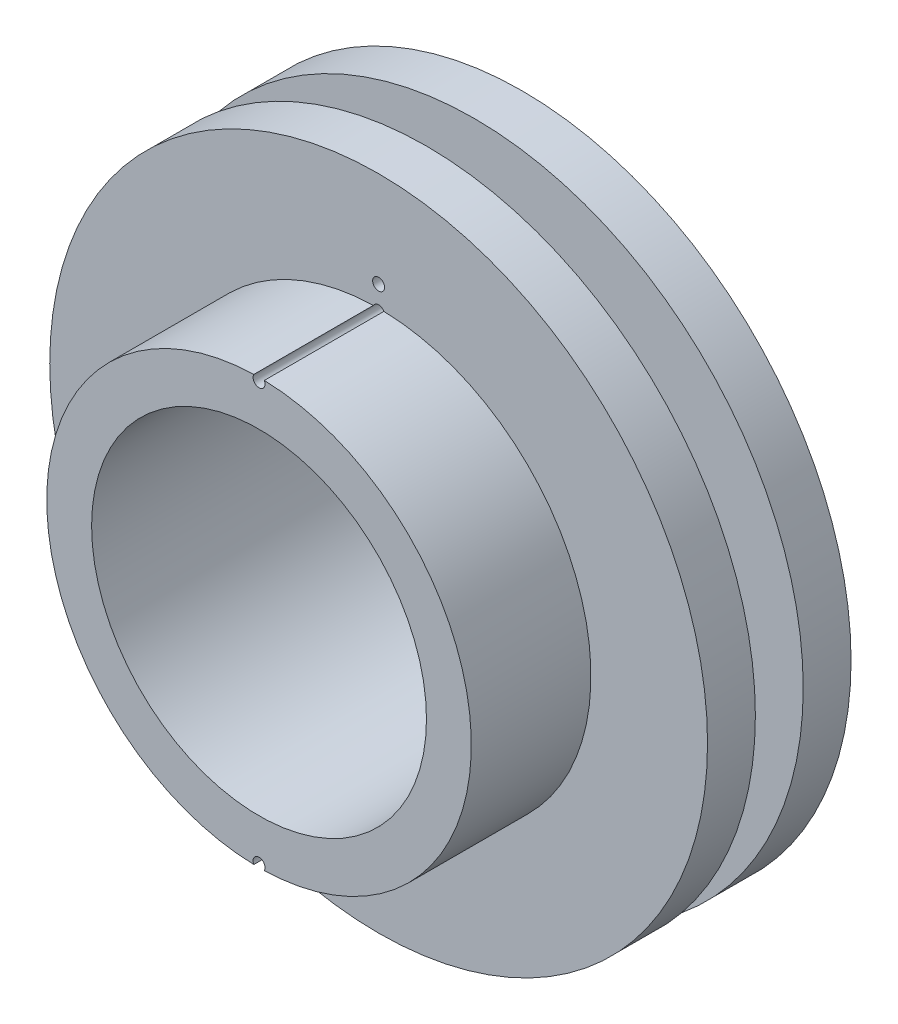
ISO-10303-21;
HEADER;
FILE_DESCRIPTION(('STEP AP214'),'2;1');
FILE_NAME('part.step','',(''),(''),'','','');
FILE_SCHEMA(('AUTOMOTIVE_DESIGN { 1 0 10303 214 1 1 1 1 }'));
ENDSEC;
DATA;
#1=APPLICATION_CONTEXT('core data for automotive mechanical design processes');
#2=APPLICATION_PROTOCOL_DEFINITION('international standard','automotive_design',2000,#1);
#3=PRODUCT_CONTEXT('',#1,'mechanical');
#4=PRODUCT('Part','Part','',(#3));
#5=PRODUCT_RELATED_PRODUCT_CATEGORY('part','',(#4));
#6=PRODUCT_DEFINITION_FORMATION('','',#4);
#7=PRODUCT_DEFINITION_CONTEXT('part definition',#1,'design');
#8=PRODUCT_DEFINITION('design','',#6,#7);
#9=PRODUCT_DEFINITION_SHAPE('','',#8);
#10=(LENGTH_UNIT() NAMED_UNIT(*) SI_UNIT(.MILLI.,.METRE.));
#11=(NAMED_UNIT(*) PLANE_ANGLE_UNIT() SI_UNIT($,.RADIAN.));
#12=(NAMED_UNIT(*) SI_UNIT($,.STERADIAN.) SOLID_ANGLE_UNIT());
#13=UNCERTAINTY_MEASURE_WITH_UNIT(LENGTH_MEASURE(1.E-05),#10,'distance_accuracy_value','');
#14=(GEOMETRIC_REPRESENTATION_CONTEXT(3) GLOBAL_UNCERTAINTY_ASSIGNED_CONTEXT((#13)) GLOBAL_UNIT_ASSIGNED_CONTEXT((#10,
#11,#12)) REPRESENTATION_CONTEXT('',''));
#15=CARTESIAN_POINT('',(0.,0.,0.));
#16=DIRECTION('',(0.,0.,1.));
#17=DIRECTION('',(1.,0.,0.));
#18=AXIS2_PLACEMENT_3D('',#15,#16,#17);
#19=CARTESIAN_POINT('',(0.,0.,6.));
#20=DIRECTION('',(0.,0.,1.));
#21=DIRECTION('',(1.,0.,0.));
#22=AXIS2_PLACEMENT_3D('',#19,#20,#21);
#23=PLANE('',#22);
#24=CARTESIAN_POINT('',(0.,9.75,6.));
#25=DIRECTION('',(0.,0.,1.));
#26=DIRECTION('',(1.,0.,0.));
#27=AXIS2_PLACEMENT_3D('',#24,#25,#26);
#28=CIRCLE('',#27,0.25);
#29=CARTESIAN_POINT('',(0.25,9.75,6.));
#30=VERTEX_POINT('',#29);
#31=EDGE_CURVE('E150',#30,#30,#28,.F.);
#32=ORIENTED_EDGE('',*,*,#31,.T.);
#33=EDGE_LOOP('',(#32));
#34=FACE_BOUND('',#33,.T.);
#35=CARTESIAN_POINT('',(0.,0.,6.));
#36=DIRECTION('',(0.,0.,1.));
#37=DIRECTION('',(1.,0.,0.));
#38=AXIS2_PLACEMENT_3D('',#35,#36,#37);
#39=CIRCLE('',#38,13.75);
#40=CARTESIAN_POINT('',(13.75,0.,6.));
#41=VERTEX_POINT('',#40);
#42=EDGE_CURVE('E107',#41,#41,#39,.T.);
#43=ORIENTED_EDGE('',*,*,#42,.T.);
#44=EDGE_LOOP('',(#43));
#45=FACE_BOUND('',#44,.T.);
#46=CARTESIAN_POINT('',(0.,-9.75,6.));
#47=DIRECTION('',(0.,0.,1.));
#48=DIRECTION('',(1.,0.,0.));
#49=AXIS2_PLACEMENT_3D('',#46,#47,#48);
#50=CIRCLE('',#49,0.25);
#51=CARTESIAN_POINT('',(0.25,-9.75,6.));
#52=VERTEX_POINT('',#51);
#53=EDGE_CURVE('E140',#52,#52,#50,.F.);
#54=ORIENTED_EDGE('',*,*,#53,.T.);
#55=EDGE_LOOP('',(#54));
#56=FACE_BOUND('',#55,.T.);
#57=CARTESIAN_POINT('',(0.,0.,6.));
#58=DIRECTION('',(0.,0.,1.));
#59=DIRECTION('',(1.,0.,0.));
#60=AXIS2_PLACEMENT_3D('',#57,#58,#59);
#61=CIRCLE('',#60,8.875);
#62=CARTESIAN_POINT('',(0.218030887977479,-8.87232142857143,6.));
#63=VERTEX_POINT('',#62);
#64=CARTESIAN_POINT('',(0.218030887977508,8.87232142857143,6.));
#65=VERTEX_POINT('',#64);
#66=EDGE_CURVE('E105',#63,#65,#61,.T.);
#67=ORIENTED_EDGE('',*,*,#66,.F.);
#68=CARTESIAN_POINT('',(0.,-8.75,6.));
#69=DIRECTION('',(0.,0.,1.));
#70=DIRECTION('',(1.,0.,0.));
#71=AXIS2_PLACEMENT_3D('',#68,#69,#70);
#72=CIRCLE('',#71,0.25);
#73=CARTESIAN_POINT('',(-0.218030887977508,-8.87232142857143,6.));
#74=VERTEX_POINT('',#73);
#75=EDGE_CURVE('E47',#63,#74,#72,.F.);
#76=ORIENTED_EDGE('',*,*,#75,.T.);
#77=CARTESIAN_POINT('',(-0.21803088797748,8.87232142857143,6.));
#78=VERTEX_POINT('',#77);
#79=EDGE_CURVE('E90',#78,#74,#61,.T.);
#80=ORIENTED_EDGE('',*,*,#79,.F.);
#81=CARTESIAN_POINT('',(0.,8.75,6.));
#82=DIRECTION('',(0.,0.,1.));
#83=DIRECTION('',(1.,0.,0.));
#84=AXIS2_PLACEMENT_3D('',#81,#82,#83);
#85=CIRCLE('',#84,0.25);
#86=EDGE_CURVE('E133',#78,#65,#85,.F.);
#87=ORIENTED_EDGE('',*,*,#86,.T.);
#88=EDGE_LOOP('',(#67,#76,#80,#87));
#89=FACE_BOUND('',#88,.T.);
#90=ADVANCED_FACE('F33',(#34,#45,#56,#89),#23,.T.);
#91=CARTESIAN_POINT('',(0.,0.,4.));
#92=DIRECTION('',(0.,0.,1.));
#93=DIRECTION('',(1.,0.,0.));
#94=AXIS2_PLACEMENT_3D('',#91,#92,#93);
#95=PLANE('',#94);
#96=CARTESIAN_POINT('',(0.,9.75,4.));
#97=DIRECTION('',(0.,0.,1.));
#98=DIRECTION('',(1.,0.,0.));
#99=AXIS2_PLACEMENT_3D('',#96,#97,#98);
#100=CIRCLE('',#99,0.25);
#101=CARTESIAN_POINT('',(0.25,9.75,4.));
#102=VERTEX_POINT('',#101);
#103=EDGE_CURVE('E148',#102,#102,#100,.T.);
#104=ORIENTED_EDGE('',*,*,#103,.T.);
#105=EDGE_LOOP('',(#104));
#106=FACE_BOUND('',#105,.T.);
#107=CARTESIAN_POINT('',(0.,0.,4.));
#108=DIRECTION('',(0.,0.,1.));
#109=DIRECTION('',(1.,0.,0.));
#110=AXIS2_PLACEMENT_3D('',#107,#108,#109);
#111=CIRCLE('',#110,13.75);
#112=CARTESIAN_POINT('',(13.75,0.,4.));
#113=VERTEX_POINT('',#112);
#114=EDGE_CURVE('E99',#113,#113,#111,.T.);
#115=ORIENTED_EDGE('',*,*,#114,.F.);
#116=EDGE_LOOP('',(#115));
#117=FACE_BOUND('',#116,.T.);
#118=CARTESIAN_POINT('',(0.,-9.75,4.));
#119=DIRECTION('',(0.,0.,1.));
#120=DIRECTION('',(1.,0.,0.));
#121=AXIS2_PLACEMENT_3D('',#118,#119,#120);
#122=CIRCLE('',#121,0.25);
#123=CARTESIAN_POINT('',(0.25,-9.75,4.));
#124=VERTEX_POINT('',#123);
#125=EDGE_CURVE('E137',#124,#124,#122,.T.);
#126=ORIENTED_EDGE('',*,*,#125,.T.);
#127=EDGE_LOOP('',(#126));
#128=FACE_BOUND('',#127,.T.);
#129=CARTESIAN_POINT('',(0.,0.,4.));
#130=DIRECTION('',(0.,0.,1.));
#131=DIRECTION('',(1.,0.,0.));
#132=AXIS2_PLACEMENT_3D('',#129,#130,#131);
#133=CIRCLE('',#132,8.5);
#134=CARTESIAN_POINT('',(0.,8.5,4.));
#135=VERTEX_POINT('',#134);
#136=CARTESIAN_POINT('',(0.,-8.5,4.));
#137=VERTEX_POINT('',#136);
#138=EDGE_CURVE('E122',#135,#137,#133,.T.);
#139=ORIENTED_EDGE('',*,*,#138,.T.);
#140=CARTESIAN_POINT('',(0.,-8.75,4.));
#141=DIRECTION('',(0.,0.,1.));
#142=DIRECTION('',(1.,0.,0.));
#143=AXIS2_PLACEMENT_3D('',#140,#141,#142);
#144=CIRCLE('',#143,0.25);
#145=EDGE_CURVE('E53',#137,#137,#144,.T.);
#146=ORIENTED_EDGE('',*,*,#145,.T.);
#147=EDGE_CURVE('E119',#137,#135,#133,.T.);
#148=ORIENTED_EDGE('',*,*,#147,.T.);
#149=CARTESIAN_POINT('',(0.,8.75,4.));
#150=DIRECTION('',(0.,0.,1.));
#151=DIRECTION('',(1.,0.,0.));
#152=AXIS2_PLACEMENT_3D('',#149,#150,#151);
#153=CIRCLE('',#152,0.25);
#154=EDGE_CURVE('E142',#135,#135,#153,.T.);
#155=ORIENTED_EDGE('',*,*,#154,.T.);
#156=EDGE_LOOP('',(#139,#146,#148,#155));
#157=FACE_BOUND('',#156,.T.);
#158=ADVANCED_FACE('F170',(#106,#117,#128,#157),#95,.F.);
#159=CARTESIAN_POINT('',(0.,0.,11.));
#160=DIRECTION('',(0.,0.,1.));
#161=DIRECTION('',(1.,0.,0.));
#162=AXIS2_PLACEMENT_3D('',#159,#160,#161);
#163=PLANE('',#162);
#164=CARTESIAN_POINT('',(0.,0.,11.));
#165=DIRECTION('',(0.,0.,1.));
#166=DIRECTION('',(1.,0.,0.));
#167=AXIS2_PLACEMENT_3D('',#164,#165,#166);
#168=CIRCLE('',#167,7.);
#169=CARTESIAN_POINT('',(7.,0.,11.));
#170=VERTEX_POINT('',#169);
#171=EDGE_CURVE('E103',#170,#170,#168,.T.);
#172=ORIENTED_EDGE('',*,*,#171,.F.);
#173=EDGE_LOOP('',(#172));
#174=FACE_BOUND('',#173,.T.);
#175=CARTESIAN_POINT('',(0.,0.,11.));
#176=DIRECTION('',(0.,0.,1.));
#177=DIRECTION('',(1.,0.,0.));
#178=AXIS2_PLACEMENT_3D('',#175,#176,#177);
#179=CIRCLE('',#178,8.875);
#180=CARTESIAN_POINT('',(-0.218030887977472,8.87232142857143,11.));
#181=VERTEX_POINT('',#180);
#182=CARTESIAN_POINT('',(-0.218030887977472,-8.87232142857143,11.));
#183=VERTEX_POINT('',#182);
#184=EDGE_CURVE('E88',#181,#183,#179,.T.);
#185=ORIENTED_EDGE('',*,*,#184,.T.);
#186=CARTESIAN_POINT('',(0.,-8.75,11.));
#187=DIRECTION('',(0.,0.,1.));
#188=DIRECTION('',(1.,0.,0.));
#189=AXIS2_PLACEMENT_3D('',#186,#187,#188);
#190=CIRCLE('',#189,0.25);
#191=CARTESIAN_POINT('',(0.218030887977472,-8.87232142857143,11.));
#192=VERTEX_POINT('',#191);
#193=EDGE_CURVE('E76',#192,#183,#190,.T.);
#194=ORIENTED_EDGE('',*,*,#193,.F.);
#195=CARTESIAN_POINT('',(0.218030887977472,8.87232142857143,11.));
#196=VERTEX_POINT('',#195);
#197=EDGE_CURVE('E96',#192,#196,#179,.T.);
#198=ORIENTED_EDGE('',*,*,#197,.T.);
#199=CARTESIAN_POINT('',(0.,8.75,11.));
#200=DIRECTION('',(0.,0.,1.));
#201=DIRECTION('',(1.,0.,0.));
#202=AXIS2_PLACEMENT_3D('',#199,#200,#201);
#203=CIRCLE('',#202,0.25);
#204=EDGE_CURVE('E94',#181,#196,#203,.T.);
#205=ORIENTED_EDGE('',*,*,#204,.F.);
#206=EDGE_LOOP('',(#185,#194,#198,#205));
#207=FACE_BOUND('',#206,.T.);
#208=ADVANCED_FACE('F92',(#174,#207),#163,.T.);
#209=CARTESIAN_POINT('',(0.,0.,11.));
#210=DIRECTION('',(0.,0.,-1.));
#211=DIRECTION('',(-1.,0.,0.));
#212=AXIS2_PLACEMENT_3D('',#209,#210,#211);
#213=CYLINDRICAL_SURFACE('',#212,8.875);
#214=DIRECTION('',(0.,0.,-1.));
#215=VECTOR('',#214,1.);
#216=CARTESIAN_POINT('',(-0.218030887977481,-8.87232142857141,7.5));
#217=LINE('',#216,#215);
#218=EDGE_CURVE('E11',#183,#74,#217,.T.);
#219=ORIENTED_EDGE('',*,*,#218,.F.);
#220=ORIENTED_EDGE('',*,*,#184,.F.);
#221=DIRECTION('',(0.,0.,-1.));
#222=VECTOR('',#221,1.);
#223=CARTESIAN_POINT('',(-0.218030887977481,8.87232142857141,7.5));
#224=LINE('',#223,#222);
#225=EDGE_CURVE('E125',#78,#181,#224,.F.);
#226=ORIENTED_EDGE('',*,*,#225,.F.);
#227=ORIENTED_EDGE('',*,*,#79,.T.);
#228=EDGE_LOOP('',(#219,#220,#226,#227));
#229=FACE_BOUND('',#228,.T.);
#230=ADVANCED_FACE('F86',(#229),#213,.T.);
#231=DIRECTION('',(0.,0.,-1.));
#232=VECTOR('',#231,1.);
#233=CARTESIAN_POINT('',(0.218030887977481,-8.87232142857141,7.5));
#234=LINE('',#233,#232);
#235=EDGE_CURVE('E41',#63,#192,#234,.F.);
#236=ORIENTED_EDGE('',*,*,#235,.F.);
#237=ORIENTED_EDGE('',*,*,#66,.T.);
#238=DIRECTION('',(0.,0.,-1.));
#239=VECTOR('',#238,1.);
#240=CARTESIAN_POINT('',(0.218030887977481,8.87232142857141,7.5));
#241=LINE('',#240,#239);
#242=EDGE_CURVE('E127',#196,#65,#241,.T.);
#243=ORIENTED_EDGE('',*,*,#242,.F.);
#244=ORIENTED_EDGE('',*,*,#197,.F.);
#245=EDGE_LOOP('',(#236,#237,#243,#244));
#246=FACE_BOUND('',#245,.T.);
#247=ADVANCED_FACE('F157',(#246),#213,.T.);
#248=CARTESIAN_POINT('',(0.,0.,0.));
#249=DIRECTION('',(0.,0.,1.));
#250=DIRECTION('',(1.,0.,0.));
#251=AXIS2_PLACEMENT_3D('',#248,#249,#250);
#252=PLANE('',#251);
#253=CARTESIAN_POINT('',(0.,0.,0.));
#254=DIRECTION('',(0.,0.,1.));
#255=DIRECTION('',(1.,0.,0.));
#256=AXIS2_PLACEMENT_3D('',#253,#254,#255);
#257=CIRCLE('',#256,13.75);
#258=CARTESIAN_POINT('',(13.75,0.,0.));
#259=VERTEX_POINT('',#258);
#260=EDGE_CURVE('E115',#259,#259,#257,.T.);
#261=ORIENTED_EDGE('',*,*,#260,.F.);
#262=EDGE_LOOP('',(#261));
#263=FACE_BOUND('',#262,.T.);
#264=CARTESIAN_POINT('',(0.,0.,0.));
#265=DIRECTION('',(0.,0.,1.));
#266=DIRECTION('',(1.,0.,0.));
#267=AXIS2_PLACEMENT_3D('',#264,#265,#266);
#268=CIRCLE('',#267,7.);
#269=CARTESIAN_POINT('',(7.,0.,0.));
#270=VERTEX_POINT('',#269);
#271=EDGE_CURVE('E95',#270,#270,#268,.T.);
#272=ORIENTED_EDGE('',*,*,#271,.T.);
#273=EDGE_LOOP('',(#272));
#274=FACE_BOUND('',#273,.T.);
#275=ADVANCED_FACE('F159',(#263,#274),#252,.F.);
#276=CARTESIAN_POINT('',(0.,0.,6.));
#277=DIRECTION('',(0.,0.,-1.));
#278=DIRECTION('',(-1.,0.,0.));
#279=AXIS2_PLACEMENT_3D('',#276,#277,#278);
#280=CYLINDRICAL_SURFACE('',#279,8.5);
#281=CARTESIAN_POINT('',(0.,0.,2.));
#282=DIRECTION('',(0.,0.,1.));
#283=DIRECTION('',(1.,0.,0.));
#284=AXIS2_PLACEMENT_3D('',#281,#282,#283);
#285=CIRCLE('',#284,8.5);
#286=CARTESIAN_POINT('',(8.5,0.,2.));
#287=VERTEX_POINT('',#286);
#288=EDGE_CURVE('E110',#287,#287,#285,.F.);
#289=ORIENTED_EDGE('',*,*,#288,.F.);
#290=EDGE_LOOP('',(#289));
#291=FACE_BOUND('',#290,.T.);
#292=ORIENTED_EDGE('',*,*,#138,.F.);
#293=ORIENTED_EDGE('',*,*,#147,.F.);
#294=EDGE_LOOP('',(#292,#293));
#295=FACE_BOUND('',#294,.T.);
#296=ADVANCED_FACE('F165',(#291,#295),#280,.T.);
#297=CARTESIAN_POINT('',(0.,0.,2.));
#298=DIRECTION('',(0.,0.,1.));
#299=DIRECTION('',(1.,0.,0.));
#300=AXIS2_PLACEMENT_3D('',#297,#298,#299);
#301=PLANE('',#300);
#302=CARTESIAN_POINT('',(0.,0.,2.));
#303=DIRECTION('',(0.,0.,1.));
#304=DIRECTION('',(1.,0.,0.));
#305=AXIS2_PLACEMENT_3D('',#302,#303,#304);
#306=CIRCLE('',#305,13.75);
#307=CARTESIAN_POINT('',(13.75,0.,2.));
#308=VERTEX_POINT('',#307);
#309=EDGE_CURVE('E116',#308,#308,#306,.T.);
#310=ORIENTED_EDGE('',*,*,#309,.T.);
#311=EDGE_LOOP('',(#310));
#312=FACE_BOUND('',#311,.T.);
#313=ORIENTED_EDGE('',*,*,#288,.T.);
#314=EDGE_LOOP('',(#313));
#315=FACE_BOUND('',#314,.T.);
#316=ADVANCED_FACE('F183',(#312,#315),#301,.T.);
#317=CARTESIAN_POINT('',(0.,0.,2.));
#318=DIRECTION('',(0.,0.,-1.));
#319=DIRECTION('',(-1.,0.,0.));
#320=AXIS2_PLACEMENT_3D('',#317,#318,#319);
#321=CYLINDRICAL_SURFACE('',#320,13.75);
#322=ORIENTED_EDGE('',*,*,#309,.F.);
#323=EDGE_LOOP('',(#322));
#324=FACE_BOUND('',#323,.T.);
#325=ORIENTED_EDGE('',*,*,#260,.T.);
#326=EDGE_LOOP('',(#325));
#327=FACE_BOUND('',#326,.T.);
#328=ADVANCED_FACE('F35',(#324,#327),#321,.T.);
#329=CARTESIAN_POINT('',(0.,0.,6.));
#330=DIRECTION('',(0.,0.,-1.));
#331=DIRECTION('',(-1.,0.,0.));
#332=AXIS2_PLACEMENT_3D('',#329,#330,#331);
#333=CYLINDRICAL_SURFACE('',#332,13.75);
#334=ORIENTED_EDGE('',*,*,#42,.F.);
#335=EDGE_LOOP('',(#334));
#336=FACE_BOUND('',#335,.T.);
#337=ORIENTED_EDGE('',*,*,#114,.T.);
#338=EDGE_LOOP('',(#337));
#339=FACE_BOUND('',#338,.T.);
#340=ADVANCED_FACE('F180',(#336,#339),#333,.T.);
#341=CARTESIAN_POINT('',(0.,0.,6.));
#342=DIRECTION('',(0.,0.,-1.));
#343=DIRECTION('',(-1.,0.,0.));
#344=AXIS2_PLACEMENT_3D('',#341,#342,#343);
#345=CYLINDRICAL_SURFACE('',#344,7.);
#346=ORIENTED_EDGE('',*,*,#271,.F.);
#347=EDGE_LOOP('',(#346));
#348=FACE_BOUND('',#347,.T.);
#349=ORIENTED_EDGE('',*,*,#171,.T.);
#350=EDGE_LOOP('',(#349));
#351=FACE_BOUND('',#350,.T.);
#352=ADVANCED_FACE('F216',(#348,#351),#345,.F.);
#353=CARTESIAN_POINT('',(0.,9.75,11.));
#354=DIRECTION('',(0.,0.,-1.));
#355=DIRECTION('',(-1.,0.,0.));
#356=AXIS2_PLACEMENT_3D('',#353,#354,#355);
#357=CYLINDRICAL_SURFACE('',#356,0.25);
#358=ORIENTED_EDGE('',*,*,#31,.F.);
#359=EDGE_LOOP('',(#358));
#360=FACE_BOUND('',#359,.T.);
#361=ORIENTED_EDGE('',*,*,#103,.F.);
#362=EDGE_LOOP('',(#361));
#363=FACE_BOUND('',#362,.T.);
#364=ADVANCED_FACE('F211',(#360,#363),#357,.F.);
#365=CARTESIAN_POINT('',(0.,-9.75,11.));
#366=DIRECTION('',(0.,0.,-1.));
#367=DIRECTION('',(-1.,0.,0.));
#368=AXIS2_PLACEMENT_3D('',#365,#366,#367);
#369=CYLINDRICAL_SURFACE('',#368,0.25);
#370=ORIENTED_EDGE('',*,*,#53,.F.);
#371=EDGE_LOOP('',(#370));
#372=FACE_BOUND('',#371,.T.);
#373=ORIENTED_EDGE('',*,*,#125,.F.);
#374=EDGE_LOOP('',(#373));
#375=FACE_BOUND('',#374,.T.);
#376=ADVANCED_FACE('F204',(#372,#375),#369,.F.);
#377=CARTESIAN_POINT('',(0.,8.75,11.));
#378=DIRECTION('',(0.,0.,-1.));
#379=DIRECTION('',(-1.,0.,0.));
#380=AXIS2_PLACEMENT_3D('',#377,#378,#379);
#381=CYLINDRICAL_SURFACE('',#380,0.25);
#382=ORIENTED_EDGE('',*,*,#154,.F.);
#383=EDGE_LOOP('',(#382));
#384=FACE_BOUND('',#383,.T.);
#385=ORIENTED_EDGE('',*,*,#242,.T.);
#386=ORIENTED_EDGE('',*,*,#86,.F.);
#387=ORIENTED_EDGE('',*,*,#225,.T.);
#388=ORIENTED_EDGE('',*,*,#204,.T.);
#389=EDGE_LOOP('',(#385,#386,#387,#388));
#390=FACE_BOUND('',#389,.T.);
#391=ADVANCED_FACE('F132',(#384,#390),#381,.F.);
#392=CARTESIAN_POINT('',(0.,-8.75,11.));
#393=DIRECTION('',(0.,0.,-1.));
#394=DIRECTION('',(-1.,0.,0.));
#395=AXIS2_PLACEMENT_3D('',#392,#393,#394);
#396=CYLINDRICAL_SURFACE('',#395,0.25);
#397=ORIENTED_EDGE('',*,*,#145,.F.);
#398=EDGE_LOOP('',(#397));
#399=FACE_BOUND('',#398,.T.);
#400=ORIENTED_EDGE('',*,*,#218,.T.);
#401=ORIENTED_EDGE('',*,*,#75,.F.);
#402=ORIENTED_EDGE('',*,*,#235,.T.);
#403=ORIENTED_EDGE('',*,*,#193,.T.);
#404=EDGE_LOOP('',(#400,#401,#402,#403));
#405=FACE_BOUND('',#404,.T.);
#406=ADVANCED_FACE('F78',(#399,#405),#396,.F.);
#407=CLOSED_SHELL('',(#90,#158,#208,#230,#247,#275,#296,#316,#328,#340,#352,#364,#376,#391,#406));
#408=MANIFOLD_SOLID_BREP('B2',#407);
#409=ADVANCED_BREP_SHAPE_REPRESENTATION('',(#18,#408),#14);
#410=SHAPE_DEFINITION_REPRESENTATION(#9,#409);
ENDSEC;
END-ISO-10303-21;
